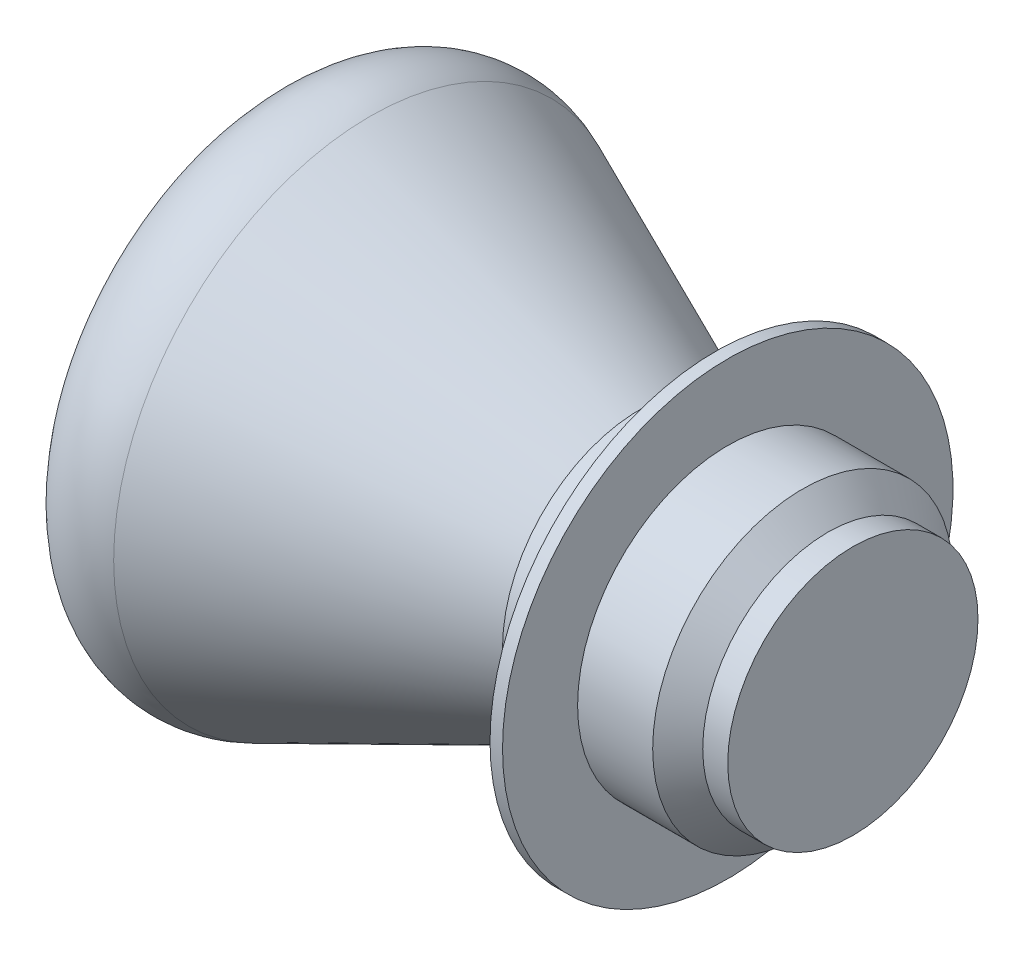
ISO-10303-21;
HEADER;
FILE_DESCRIPTION(('STEP AP214'),'2;1');
FILE_NAME('part.step','',(''),(''),'','','');
FILE_SCHEMA(('AUTOMOTIVE_DESIGN { 1 0 10303 214 1 1 1 1 }'));
ENDSEC;
DATA;
#1=APPLICATION_CONTEXT('core data for automotive mechanical design processes');
#2=APPLICATION_PROTOCOL_DEFINITION('international standard','automotive_design',2000,#1);
#3=PRODUCT_CONTEXT('',#1,'mechanical');
#4=PRODUCT('Part','Part','',(#3));
#5=PRODUCT_RELATED_PRODUCT_CATEGORY('part','',(#4));
#6=PRODUCT_DEFINITION_FORMATION('','',#4);
#7=PRODUCT_DEFINITION_CONTEXT('part definition',#1,'design');
#8=PRODUCT_DEFINITION('design','',#6,#7);
#9=PRODUCT_DEFINITION_SHAPE('','',#8);
#10=(LENGTH_UNIT() NAMED_UNIT(*) SI_UNIT(.MILLI.,.METRE.));
#11=(NAMED_UNIT(*) PLANE_ANGLE_UNIT() SI_UNIT($,.RADIAN.));
#12=(NAMED_UNIT(*) SI_UNIT($,.STERADIAN.) SOLID_ANGLE_UNIT());
#13=UNCERTAINTY_MEASURE_WITH_UNIT(LENGTH_MEASURE(1.E-05),#10,'distance_accuracy_value','');
#14=(GEOMETRIC_REPRESENTATION_CONTEXT(3) GLOBAL_UNCERTAINTY_ASSIGNED_CONTEXT((#13)) GLOBAL_UNIT_ASSIGNED_CONTEXT((#10,
#11,#12)) REPRESENTATION_CONTEXT('',''));
#15=CARTESIAN_POINT('',(0.,0.,0.));
#16=DIRECTION('',(0.,0.,1.));
#17=DIRECTION('',(1.,0.,0.));
#18=AXIS2_PLACEMENT_3D('',#15,#16,#17);
#19=CARTESIAN_POINT('',(0.,0.,0.));
#20=DIRECTION('',(-1.,0.,0.));
#21=DIRECTION('',(0.,0.,1.));
#22=AXIS2_PLACEMENT_3D('',#19,#20,#21);
#23=PLANE('',#22);
#24=CARTESIAN_POINT('',(0.,0.,0.));
#25=DIRECTION('',(-1.,0.,0.));
#26=DIRECTION('',(0.,0.,1.));
#27=AXIS2_PLACEMENT_3D('',#24,#25,#26);
#28=CIRCLE('',#27,5.5);
#29=CARTESIAN_POINT('',(0.,0.,5.5));
#30=VERTEX_POINT('',#29);
#31=EDGE_CURVE('E11',#30,#30,#28,.T.);
#32=ORIENTED_EDGE('',*,*,#31,.F.);
#33=EDGE_LOOP('',(#32));
#34=FACE_BOUND('',#33,.T.);
#35=ADVANCED_FACE('F51',(#34),#23,.F.);
#36=CARTESIAN_POINT('',(-19.1219745516296,0.,0.));
#37=DIRECTION('',(-1.,0.,0.));
#38=DIRECTION('',(0.,0.,1.));
#39=AXIS2_PLACEMENT_3D('',#36,#37,#38);
#40=CYLINDRICAL_SURFACE('',#39,5.5);
#41=CARTESIAN_POINT('',(-3.,0.,0.));
#42=DIRECTION('',(-1.,0.,0.));
#43=DIRECTION('',(0.,0.,1.));
#44=AXIS2_PLACEMENT_3D('',#41,#42,#43);
#45=CIRCLE('',#44,5.5);
#46=CARTESIAN_POINT('',(-3.,0.,5.5));
#47=VERTEX_POINT('',#46);
#48=EDGE_CURVE('E57',#47,#47,#45,.T.);
#49=ORIENTED_EDGE('',*,*,#48,.F.);
#50=EDGE_LOOP('',(#49));
#51=FACE_BOUND('',#50,.T.);
#52=ORIENTED_EDGE('',*,*,#31,.T.);
#53=EDGE_LOOP('',(#52));
#54=FACE_BOUND('',#53,.T.);
#55=ADVANCED_FACE('F81',(#51,#54),#40,.T.);
#56=CARTESIAN_POINT('',(-3.,0.,0.));
#57=DIRECTION('',(-1.,0.,0.));
#58=DIRECTION('',(0.,0.,1.));
#59=AXIS2_PLACEMENT_3D('',#56,#57,#58);
#60=CONICAL_SURFACE('',#59,5.5,0.414317443446188);
#61=CARTESIAN_POINT('',(-13.792304346383,0.,0.));
#62=DIRECTION('',(-1.,0.,0.));
#63=DIRECTION('',(0.,0.,1.));
#64=AXIS2_PLACEMENT_3D('',#61,#62,#63);
#65=CIRCLE('',#64,10.2461739217017);
#66=CARTESIAN_POINT('',(-13.792304346383,0.,10.2461739217017));
#67=VERTEX_POINT('',#66);
#68=EDGE_CURVE('E61',#67,#67,#65,.T.);
#69=ORIENTED_EDGE('',*,*,#68,.F.);
#70=EDGE_LOOP('',(#69));
#71=FACE_BOUND('',#70,.T.);
#72=ORIENTED_EDGE('',*,*,#48,.T.);
#73=EDGE_LOOP('',(#72));
#74=FACE_BOUND('',#73,.T.);
#75=ADVANCED_FACE('F76',(#71,#74),#60,.T.);
#76=CARTESIAN_POINT('',(-15.,0.,0.));
#77=DIRECTION('',(-1.,0.,0.));
#78=DIRECTION('',(0.,0.,1.));
#79=AXIS2_PLACEMENT_3D('',#76,#77,#78);
#80=TOROIDAL_SURFACE('',#79,7.5,3.);
#81=CARTESIAN_POINT('',(-17.8686643116389,0.,0.));
#82=DIRECTION('',(-1.,0.,0.));
#83=DIRECTION('',(0.,0.,1.));
#84=AXIS2_PLACEMENT_3D('',#81,#82,#83);
#85=CIRCLE('',#84,8.37793226796208);
#86=CARTESIAN_POINT('',(-17.8686643116389,0.,8.37793226796208));
#87=VERTEX_POINT('',#86);
#88=EDGE_CURVE('E65',#87,#87,#85,.T.);
#89=ORIENTED_EDGE('',*,*,#88,.F.);
#90=EDGE_LOOP('',(#89));
#91=FACE_BOUND('',#90,.T.);
#92=ORIENTED_EDGE('',*,*,#68,.T.);
#93=EDGE_LOOP('',(#92));
#94=FACE_BOUND('',#93,.T.);
#95=ADVANCED_FACE('F73',(#91,#94),#80,.T.);
#96=CARTESIAN_POINT('',(9.50642620442027,0.,0.));
#97=DIRECTION('',(-1.,0.,0.));
#98=DIRECTION('',(0.,1.,0.));
#99=AXIS2_PLACEMENT_3D('',#96,#97,#98);
#100=SPHERICAL_SURFACE('',#99,28.6284007560499);
#101=ORIENTED_EDGE('',*,*,#88,.T.);
#102=EDGE_LOOP('',(#101));
#103=FACE_BOUND('',#102,.T.);
#104=ADVANCED_FACE('F71',(#103),#100,.T.);
#105=CLOSED_SHELL('',(#35,#55,#75,#95,#104));
#106=MANIFOLD_SOLID_BREP('B2',#105);
#107=CARTESIAN_POINT('',(0.,5.5,0.));
#108=DIRECTION('',(1.,0.,0.));
#109=DIRECTION('',(0.,0.,-1.));
#110=AXIS2_PLACEMENT_3D('',#107,#108,#109);
#111=PLANE('',#110);
#112=CARTESIAN_POINT('',(0.,0.,0.));
#113=DIRECTION('',(-1.,0.,0.));
#114=DIRECTION('',(0.,0.,1.));
#115=AXIS2_PLACEMENT_3D('',#112,#113,#114);
#116=CIRCLE('',#115,5.5);
#117=CARTESIAN_POINT('',(0.,0.,5.5));
#118=VERTEX_POINT('',#117);
#119=EDGE_CURVE('E176',#118,#118,#116,.T.);
#120=ORIENTED_EDGE('',*,*,#119,.T.);
#121=EDGE_LOOP('',(#120));
#122=FACE_BOUND('',#121,.T.);
#123=ADVANCED_FACE('F142',(#122),#111,.F.);
#124=CARTESIAN_POINT('',(5.5,0.,0.));
#125=DIRECTION('',(-1.,0.,0.));
#126=DIRECTION('',(0.,0.,1.));
#127=AXIS2_PLACEMENT_3D('',#124,#125,#126);
#128=PLANE('',#127);
#129=CARTESIAN_POINT('',(5.5,0.,0.));
#130=DIRECTION('',(-1.,0.,0.));
#131=DIRECTION('',(0.,0.,1.));
#132=AXIS2_PLACEMENT_3D('',#129,#130,#131);
#133=CIRCLE('',#132,5.);
#134=CARTESIAN_POINT('',(5.5,0.,5.));
#135=VERTEX_POINT('',#134);
#136=EDGE_CURVE('E50',#135,#135,#133,.T.);
#137=ORIENTED_EDGE('',*,*,#136,.F.);
#138=EDGE_LOOP('',(#137));
#139=FACE_BOUND('',#138,.T.);
#140=ADVANCED_FACE('F230',(#139),#128,.F.);
#141=CARTESIAN_POINT('',(0.,0.,0.));
#142=DIRECTION('',(-1.,0.,0.));
#143=DIRECTION('',(0.,0.,1.));
#144=AXIS2_PLACEMENT_3D('',#141,#142,#143);
#145=CYLINDRICAL_SURFACE('',#144,5.);
#146=CARTESIAN_POINT('',(4.5,0.,0.));
#147=DIRECTION('',(-1.,0.,0.));
#148=DIRECTION('',(0.,0.,1.));
#149=AXIS2_PLACEMENT_3D('',#146,#147,#148);
#150=CIRCLE('',#149,5.);
#151=CARTESIAN_POINT('',(4.5,0.,5.));
#152=VERTEX_POINT('',#151);
#153=EDGE_CURVE('E148',#152,#152,#150,.T.);
#154=ORIENTED_EDGE('',*,*,#153,.F.);
#155=EDGE_LOOP('',(#154));
#156=FACE_BOUND('',#155,.T.);
#157=ORIENTED_EDGE('',*,*,#136,.T.);
#158=EDGE_LOOP('',(#157));
#159=FACE_BOUND('',#158,.T.);
#160=ADVANCED_FACE('F225',(#156,#159),#145,.T.);
#161=CARTESIAN_POINT('',(4.5,0.,0.));
#162=DIRECTION('',(-1.,0.,0.));
#163=DIRECTION('',(0.,0.,1.));
#164=AXIS2_PLACEMENT_3D('',#161,#162,#163);
#165=CONICAL_SURFACE('',#164,5.,0.785398163397435);
#166=CARTESIAN_POINT('',(3.49999999999997,0.,0.));
#167=DIRECTION('',(-1.,0.,0.));
#168=DIRECTION('',(0.,0.,1.));
#169=AXIS2_PLACEMENT_3D('',#166,#167,#168);
#170=CIRCLE('',#169,6.);
#171=CARTESIAN_POINT('',(3.49999999999997,0.,6.));
#172=VERTEX_POINT('',#171);
#173=EDGE_CURVE('E152',#172,#172,#170,.T.);
#174=ORIENTED_EDGE('',*,*,#173,.F.);
#175=EDGE_LOOP('',(#174));
#176=FACE_BOUND('',#175,.T.);
#177=ORIENTED_EDGE('',*,*,#153,.T.);
#178=EDGE_LOOP('',(#177));
#179=FACE_BOUND('',#178,.T.);
#180=ADVANCED_FACE('F220',(#176,#179),#165,.T.);
#181=CARTESIAN_POINT('',(0.,0.,0.));
#182=DIRECTION('',(-1.,0.,0.));
#183=DIRECTION('',(0.,0.,1.));
#184=AXIS2_PLACEMENT_3D('',#181,#182,#183);
#185=CYLINDRICAL_SURFACE('',#184,6.);
#186=CARTESIAN_POINT('',(0.499999999999974,0.,0.));
#187=DIRECTION('',(-1.,0.,0.));
#188=DIRECTION('',(0.,0.,1.));
#189=AXIS2_PLACEMENT_3D('',#186,#187,#188);
#190=CIRCLE('',#189,6.);
#191=CARTESIAN_POINT('',(0.499999999999974,0.,6.));
#192=VERTEX_POINT('',#191);
#193=EDGE_CURVE('E156',#192,#192,#190,.T.);
#194=ORIENTED_EDGE('',*,*,#193,.F.);
#195=EDGE_LOOP('',(#194));
#196=FACE_BOUND('',#195,.T.);
#197=ORIENTED_EDGE('',*,*,#173,.T.);
#198=EDGE_LOOP('',(#197));
#199=FACE_BOUND('',#198,.T.);
#200=ADVANCED_FACE('F214',(#196,#199),#185,.T.);
#201=CARTESIAN_POINT('',(0.499999999999974,6.,0.));
#202=DIRECTION('',(-1.,0.,0.));
#203=DIRECTION('',(0.,0.,1.));
#204=AXIS2_PLACEMENT_3D('',#201,#202,#203);
#205=PLANE('',#204);
#206=CARTESIAN_POINT('',(0.499999999999974,0.,0.));
#207=DIRECTION('',(-1.,0.,0.));
#208=DIRECTION('',(0.,0.,1.));
#209=AXIS2_PLACEMENT_3D('',#206,#207,#208);
#210=CIRCLE('',#209,9.);
#211=CARTESIAN_POINT('',(0.499999999999974,0.,9.));
#212=VERTEX_POINT('',#211);
#213=EDGE_CURVE('E161',#212,#212,#210,.T.);
#214=ORIENTED_EDGE('',*,*,#213,.F.);
#215=EDGE_LOOP('',(#214));
#216=FACE_BOUND('',#215,.T.);
#217=ORIENTED_EDGE('',*,*,#193,.T.);
#218=EDGE_LOOP('',(#217));
#219=FACE_BOUND('',#218,.T.);
#220=ADVANCED_FACE('F208',(#216,#219),#205,.F.);
#221=CARTESIAN_POINT('',(0.,0.,0.));
#222=DIRECTION('',(-1.,0.,0.));
#223=DIRECTION('',(0.,0.,1.));
#224=AXIS2_PLACEMENT_3D('',#221,#222,#223);
#225=CYLINDRICAL_SURFACE('',#224,9.);
#226=CARTESIAN_POINT('',(0.,0.,0.));
#227=DIRECTION('',(-1.,0.,0.));
#228=DIRECTION('',(0.,0.,1.));
#229=AXIS2_PLACEMENT_3D('',#226,#227,#228);
#230=CIRCLE('',#229,9.);
#231=CARTESIAN_POINT('',(0.,0.,9.));
#232=VERTEX_POINT('',#231);
#233=EDGE_CURVE('E164',#232,#232,#230,.T.);
#234=ORIENTED_EDGE('',*,*,#233,.F.);
#235=EDGE_LOOP('',(#234));
#236=FACE_BOUND('',#235,.T.);
#237=ORIENTED_EDGE('',*,*,#213,.T.);
#238=EDGE_LOOP('',(#237));
#239=FACE_BOUND('',#238,.T.);
#240=ADVANCED_FACE('F202',(#236,#239),#225,.T.);
#241=CARTESIAN_POINT('',(0.,9.,0.));
#242=DIRECTION('',(1.,0.,0.));
#243=DIRECTION('',(0.,0.,-1.));
#244=AXIS2_PLACEMENT_3D('',#241,#242,#243);
#245=PLANE('',#244);
#246=CARTESIAN_POINT('',(0.,0.,0.));
#247=DIRECTION('',(-1.,0.,0.));
#248=DIRECTION('',(0.,0.,1.));
#249=AXIS2_PLACEMENT_3D('',#246,#247,#248);
#250=CIRCLE('',#249,6.);
#251=CARTESIAN_POINT('',(0.,0.,6.));
#252=VERTEX_POINT('',#251);
#253=EDGE_CURVE('E167',#252,#252,#250,.T.);
#254=ORIENTED_EDGE('',*,*,#253,.F.);
#255=EDGE_LOOP('',(#254));
#256=FACE_BOUND('',#255,.T.);
#257=ORIENTED_EDGE('',*,*,#233,.T.);
#258=EDGE_LOOP('',(#257));
#259=FACE_BOUND('',#258,.T.);
#260=ADVANCED_FACE('F196',(#256,#259),#245,.F.);
#261=CARTESIAN_POINT('',(0.,0.,0.));
#262=DIRECTION('',(-1.,0.,0.));
#263=DIRECTION('',(0.,0.,1.));
#264=AXIS2_PLACEMENT_3D('',#261,#262,#263);
#265=CYLINDRICAL_SURFACE('',#264,6.);
#266=CARTESIAN_POINT('',(-2.,0.,0.));
#267=DIRECTION('',(-1.,0.,0.));
#268=DIRECTION('',(0.,0.,1.));
#269=AXIS2_PLACEMENT_3D('',#266,#267,#268);
#270=CIRCLE('',#269,6.);
#271=CARTESIAN_POINT('',(-2.,0.,6.));
#272=VERTEX_POINT('',#271);
#273=EDGE_CURVE('E170',#272,#272,#270,.T.);
#274=ORIENTED_EDGE('',*,*,#273,.F.);
#275=EDGE_LOOP('',(#274));
#276=FACE_BOUND('',#275,.T.);
#277=ORIENTED_EDGE('',*,*,#253,.T.);
#278=EDGE_LOOP('',(#277));
#279=FACE_BOUND('',#278,.T.);
#280=ADVANCED_FACE('F190',(#276,#279),#265,.T.);
#281=CARTESIAN_POINT('',(-2.,6.,0.));
#282=DIRECTION('',(1.,0.,0.));
#283=DIRECTION('',(0.,0.,-1.));
#284=AXIS2_PLACEMENT_3D('',#281,#282,#283);
#285=PLANE('',#284);
#286=CARTESIAN_POINT('',(-2.,0.,0.));
#287=DIRECTION('',(-1.,0.,0.));
#288=DIRECTION('',(0.,0.,1.));
#289=AXIS2_PLACEMENT_3D('',#286,#287,#288);
#290=CIRCLE('',#289,5.5);
#291=CARTESIAN_POINT('',(-2.,0.,5.5));
#292=VERTEX_POINT('',#291);
#293=EDGE_CURVE('E173',#292,#292,#290,.T.);
#294=ORIENTED_EDGE('',*,*,#293,.F.);
#295=EDGE_LOOP('',(#294));
#296=FACE_BOUND('',#295,.T.);
#297=ORIENTED_EDGE('',*,*,#273,.T.);
#298=EDGE_LOOP('',(#297));
#299=FACE_BOUND('',#298,.T.);
#300=ADVANCED_FACE('F184',(#296,#299),#285,.F.);
#301=CARTESIAN_POINT('',(0.,0.,0.));
#302=DIRECTION('',(-1.,0.,0.));
#303=DIRECTION('',(0.,0.,1.));
#304=AXIS2_PLACEMENT_3D('',#301,#302,#303);
#305=CYLINDRICAL_SURFACE('',#304,5.5);
#306=ORIENTED_EDGE('',*,*,#119,.F.);
#307=EDGE_LOOP('',(#306));
#308=FACE_BOUND('',#307,.T.);
#309=ORIENTED_EDGE('',*,*,#293,.T.);
#310=EDGE_LOOP('',(#309));
#311=FACE_BOUND('',#310,.T.);
#312=ADVANCED_FACE('F181',(#308,#311),#305,.F.);
#313=CLOSED_SHELL('',(#123,#140,#160,#180,#200,#220,#240,#260,#280,#300,#312));
#314=MANIFOLD_SOLID_BREP('B6',#313);
#315=ADVANCED_BREP_SHAPE_REPRESENTATION('',(#18,#106,#314),#14);
#316=SHAPE_DEFINITION_REPRESENTATION(#9,#315);
ENDSEC;
END-ISO-10303-21;
